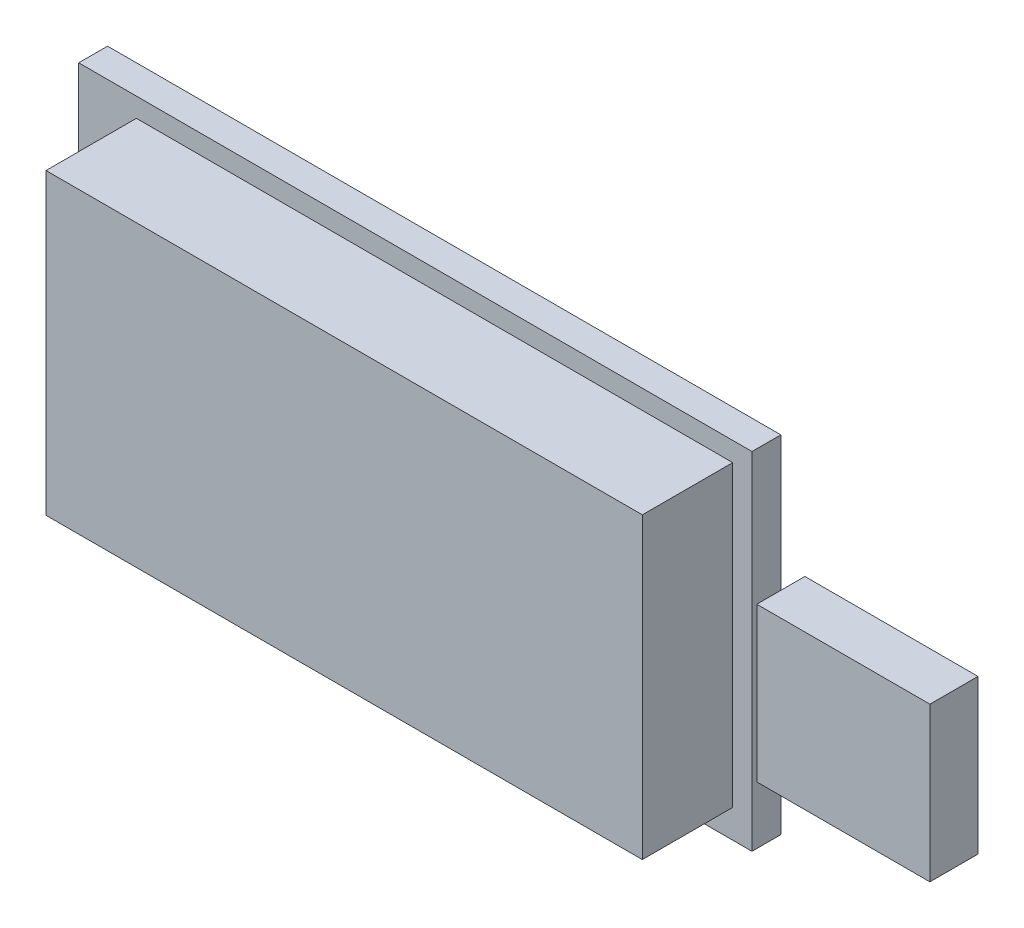
ISO-10303-21;
HEADER;
FILE_DESCRIPTION(('STEP AP214'),'2;1');
FILE_NAME('part.step','',(''),(''),'','','');
FILE_SCHEMA(('AUTOMOTIVE_DESIGN { 1 0 10303 214 1 1 1 1 }'));
ENDSEC;
DATA;
#1=APPLICATION_CONTEXT('core data for automotive mechanical design processes');
#2=APPLICATION_PROTOCOL_DEFINITION('international standard','automotive_design',2000,#1);
#3=PRODUCT_CONTEXT('',#1,'mechanical');
#4=PRODUCT('Part','Part','',(#3));
#5=PRODUCT_RELATED_PRODUCT_CATEGORY('part','',(#4));
#6=PRODUCT_DEFINITION_FORMATION('','',#4);
#7=PRODUCT_DEFINITION_CONTEXT('part definition',#1,'design');
#8=PRODUCT_DEFINITION('design','',#6,#7);
#9=PRODUCT_DEFINITION_SHAPE('','',#8);
#10=(LENGTH_UNIT() NAMED_UNIT(*) SI_UNIT(.MILLI.,.METRE.));
#11=(NAMED_UNIT(*) PLANE_ANGLE_UNIT() SI_UNIT($,.RADIAN.));
#12=(NAMED_UNIT(*) SI_UNIT($,.STERADIAN.) SOLID_ANGLE_UNIT());
#13=UNCERTAINTY_MEASURE_WITH_UNIT(LENGTH_MEASURE(1.E-05),#10,'distance_accuracy_value','');
#14=(GEOMETRIC_REPRESENTATION_CONTEXT(3) GLOBAL_UNCERTAINTY_ASSIGNED_CONTEXT((#13)) GLOBAL_UNIT_ASSIGNED_CONTEXT((#10,
#11,#12)) REPRESENTATION_CONTEXT('',''));
#15=CARTESIAN_POINT('',(0.,0.,0.));
#16=DIRECTION('',(0.,0.,1.));
#17=DIRECTION('',(1.,0.,0.));
#18=AXIS2_PLACEMENT_3D('',#15,#16,#17);
#19=CARTESIAN_POINT('',(35.,0.,1.5));
#20=DIRECTION('',(-1.,0.,0.));
#21=DIRECTION('',(0.,0.,1.));
#22=AXIS2_PLACEMENT_3D('',#19,#20,#21);
#23=PLANE('',#22);
#24=DIRECTION('',(0.,0.,-1.));
#25=VECTOR('',#24,1.);
#26=CARTESIAN_POINT('',(35.,3.,1.25));
#27=LINE('',#26,#25);
#28=CARTESIAN_POINT('',(35.,3.,1.25));
#29=VERTEX_POINT('',#28);
#30=CARTESIAN_POINT('',(35.,3.,0.));
#31=VERTEX_POINT('',#30);
#32=EDGE_CURVE('E167',#29,#31,#27,.T.);
#33=ORIENTED_EDGE('',*,*,#32,.F.);
#34=DIRECTION('',(0.,1.,0.));
#35=VECTOR('',#34,1.);
#36=CARTESIAN_POINT('',(35.,0.,1.25));
#37=LINE('',#36,#35);
#38=CARTESIAN_POINT('',(35.,11.,1.25));
#39=VERTEX_POINT('',#38);
#40=EDGE_CURVE('E244',#29,#39,#37,.T.);
#41=ORIENTED_EDGE('',*,*,#40,.T.);
#42=DIRECTION('',(0.,0.,-1.));
#43=VECTOR('',#42,1.);
#44=CARTESIAN_POINT('',(35.,11.,1.25));
#45=LINE('',#44,#43);
#46=CARTESIAN_POINT('',(35.,11.,0.));
#47=VERTEX_POINT('',#46);
#48=EDGE_CURVE('E241',#39,#47,#45,.T.);
#49=ORIENTED_EDGE('',*,*,#48,.T.);
#50=DIRECTION('',(0.,1.,0.));
#51=VECTOR('',#50,1.);
#52=CARTESIAN_POINT('',(35.,0.,0.));
#53=LINE('',#52,#51);
#54=CARTESIAN_POINT('',(35.,18.,0.));
#55=VERTEX_POINT('',#54);
#56=EDGE_CURVE('E126',#47,#55,#53,.T.);
#57=ORIENTED_EDGE('',*,*,#56,.T.);
#58=DIRECTION('',(0.,0.,-1.));
#59=VECTOR('',#58,1.);
#60=CARTESIAN_POINT('',(35.,18.,1.5));
#61=LINE('',#60,#59);
#62=CARTESIAN_POINT('',(35.,18.,1.5));
#63=VERTEX_POINT('',#62);
#64=EDGE_CURVE('E52',#63,#55,#61,.T.);
#65=ORIENTED_EDGE('',*,*,#64,.F.);
#66=DIRECTION('',(0.,1.,0.));
#67=VECTOR('',#66,1.);
#68=CARTESIAN_POINT('',(35.,0.,1.5));
#69=LINE('',#68,#67);
#70=CARTESIAN_POINT('',(35.,0.,1.5));
#71=VERTEX_POINT('',#70);
#72=EDGE_CURVE('E111',#71,#63,#69,.T.);
#73=ORIENTED_EDGE('',*,*,#72,.F.);
#74=DIRECTION('',(0.,0.,-1.));
#75=VECTOR('',#74,1.);
#76=CARTESIAN_POINT('',(35.,0.,1.5));
#77=LINE('',#76,#75);
#78=CARTESIAN_POINT('',(35.,0.,0.));
#79=VERTEX_POINT('',#78);
#80=EDGE_CURVE('E11',#71,#79,#77,.T.);
#81=ORIENTED_EDGE('',*,*,#80,.T.);
#82=EDGE_CURVE('E144',#79,#31,#53,.T.);
#83=ORIENTED_EDGE('',*,*,#82,.T.);
#84=EDGE_LOOP('',(#33,#41,#49,#57,#65,#73,#81,#83));
#85=FACE_BOUND('',#84,.T.);
#86=ADVANCED_FACE('F43',(#85),#23,.F.);
#87=CARTESIAN_POINT('',(0.,0.,1.5));
#88=DIRECTION('',(0.,1.,0.));
#89=DIRECTION('',(0.,0.,1.));
#90=AXIS2_PLACEMENT_3D('',#87,#88,#89);
#91=PLANE('',#90);
#92=DIRECTION('',(1.,0.,0.));
#93=VECTOR('',#92,1.);
#94=CARTESIAN_POINT('',(0.,0.,0.));
#95=LINE('',#94,#93);
#96=CARTESIAN_POINT('',(0.,0.,0.));
#97=VERTEX_POINT('',#96);
#98=EDGE_CURVE('E140',#97,#79,#95,.T.);
#99=ORIENTED_EDGE('',*,*,#98,.T.);
#100=ORIENTED_EDGE('',*,*,#80,.F.);
#101=DIRECTION('',(1.,0.,0.));
#102=VECTOR('',#101,1.);
#103=CARTESIAN_POINT('',(0.,0.,1.5));
#104=LINE('',#103,#102);
#105=CARTESIAN_POINT('',(0.,0.,1.5));
#106=VERTEX_POINT('',#105);
#107=EDGE_CURVE('E117',#106,#71,#104,.T.);
#108=ORIENTED_EDGE('',*,*,#107,.F.);
#109=DIRECTION('',(0.,0.,-1.));
#110=VECTOR('',#109,1.);
#111=CARTESIAN_POINT('',(0.,0.,1.5));
#112=LINE('',#111,#110);
#113=EDGE_CURVE('E68',#106,#97,#112,.T.);
#114=ORIENTED_EDGE('',*,*,#113,.T.);
#115=EDGE_LOOP('',(#99,#100,#108,#114));
#116=FACE_BOUND('',#115,.T.);
#117=ADVANCED_FACE('F45',(#116),#91,.F.);
#118=CARTESIAN_POINT('',(0.,18.,1.5));
#119=DIRECTION('',(0.,1.,0.));
#120=DIRECTION('',(0.,0.,1.));
#121=AXIS2_PLACEMENT_3D('',#118,#119,#120);
#122=PLANE('',#121);
#123=DIRECTION('',(1.,0.,0.));
#124=VECTOR('',#123,1.);
#125=CARTESIAN_POINT('',(0.,18.,0.));
#126=LINE('',#125,#124);
#127=CARTESIAN_POINT('',(0.,18.,0.));
#128=VERTEX_POINT('',#127);
#129=EDGE_CURVE('E148',#128,#55,#126,.T.);
#130=ORIENTED_EDGE('',*,*,#129,.F.);
#131=DIRECTION('',(0.,0.,-1.));
#132=VECTOR('',#131,1.);
#133=CARTESIAN_POINT('',(0.,18.,1.5));
#134=LINE('',#133,#132);
#135=CARTESIAN_POINT('',(0.,18.,1.5));
#136=VERTEX_POINT('',#135);
#137=EDGE_CURVE('E131',#136,#128,#134,.T.);
#138=ORIENTED_EDGE('',*,*,#137,.F.);
#139=DIRECTION('',(1.,0.,0.));
#140=VECTOR('',#139,1.);
#141=CARTESIAN_POINT('',(0.,18.,1.5));
#142=LINE('',#141,#140);
#143=EDGE_CURVE('E116',#136,#63,#142,.T.);
#144=ORIENTED_EDGE('',*,*,#143,.T.);
#145=ORIENTED_EDGE('',*,*,#64,.T.);
#146=EDGE_LOOP('',(#130,#138,#144,#145));
#147=FACE_BOUND('',#146,.T.);
#148=ADVANCED_FACE('F132',(#147),#122,.T.);
#149=CARTESIAN_POINT('',(0.,0.,1.5));
#150=DIRECTION('',(-1.,0.,0.));
#151=DIRECTION('',(0.,0.,1.));
#152=AXIS2_PLACEMENT_3D('',#149,#150,#151);
#153=PLANE('',#152);
#154=DIRECTION('',(0.,1.,0.));
#155=VECTOR('',#154,1.);
#156=CARTESIAN_POINT('',(0.,0.,0.));
#157=LINE('',#156,#155);
#158=EDGE_CURVE('E152',#97,#128,#157,.T.);
#159=ORIENTED_EDGE('',*,*,#158,.F.);
#160=ORIENTED_EDGE('',*,*,#113,.F.);
#161=DIRECTION('',(0.,1.,0.));
#162=VECTOR('',#161,1.);
#163=CARTESIAN_POINT('',(0.,0.,1.5));
#164=LINE('',#163,#162);
#165=EDGE_CURVE('E134',#106,#136,#164,.T.);
#166=ORIENTED_EDGE('',*,*,#165,.T.);
#167=ORIENTED_EDGE('',*,*,#137,.T.);
#168=EDGE_LOOP('',(#159,#160,#166,#167));
#169=FACE_BOUND('',#168,.T.);
#170=ADVANCED_FACE('F159',(#169),#153,.T.);
#171=CARTESIAN_POINT('',(0.,0.,1.5));
#172=DIRECTION('',(0.,0.,1.));
#173=DIRECTION('',(1.,0.,0.));
#174=AXIS2_PLACEMENT_3D('',#171,#172,#173);
#175=PLANE('',#174);
#176=DIRECTION('',(0.,1.,0.));
#177=VECTOR('',#176,1.);
#178=CARTESIAN_POINT('',(34.,0.,1.5));
#179=LINE('',#178,#177);
#180=CARTESIAN_POINT('',(34.,1.47731756426029,1.5));
#181=VERTEX_POINT('',#180);
#182=CARTESIAN_POINT('',(34.,17.,1.5));
#183=VERTEX_POINT('',#182);
#184=EDGE_CURVE('E96',#181,#183,#179,.T.);
#185=ORIENTED_EDGE('',*,*,#184,.F.);
#186=DIRECTION('',(1.,0.,0.));
#187=VECTOR('',#186,1.);
#188=CARTESIAN_POINT('',(0.,1.47731756426029,1.5));
#189=LINE('',#188,#187);
#190=CARTESIAN_POINT('',(3.,1.47731756426029,1.5));
#191=VERTEX_POINT('',#190);
#192=EDGE_CURVE('E196',#191,#181,#189,.T.);
#193=ORIENTED_EDGE('',*,*,#192,.F.);
#194=DIRECTION('',(0.,-1.,0.));
#195=VECTOR('',#194,1.);
#196=CARTESIAN_POINT('',(3.,0.,1.5));
#197=LINE('',#196,#195);
#198=CARTESIAN_POINT('',(3.,17.,1.5));
#199=VERTEX_POINT('',#198);
#200=EDGE_CURVE('E198',#199,#191,#197,.T.);
#201=ORIENTED_EDGE('',*,*,#200,.F.);
#202=DIRECTION('',(-1.,0.,0.));
#203=VECTOR('',#202,1.);
#204=CARTESIAN_POINT('',(0.,17.,1.5));
#205=LINE('',#204,#203);
#206=EDGE_CURVE('E214',#183,#199,#205,.T.);
#207=ORIENTED_EDGE('',*,*,#206,.F.);
#208=EDGE_LOOP('',(#185,#193,#201,#207));
#209=FACE_BOUND('',#208,.T.);
#210=ORIENTED_EDGE('',*,*,#107,.T.);
#211=ORIENTED_EDGE('',*,*,#72,.T.);
#212=ORIENTED_EDGE('',*,*,#143,.F.);
#213=ORIENTED_EDGE('',*,*,#165,.F.);
#214=EDGE_LOOP('',(#210,#211,#212,#213));
#215=FACE_BOUND('',#214,.T.);
#216=ADVANCED_FACE('F113',(#209,#215),#175,.T.);
#217=CARTESIAN_POINT('',(0.,0.,0.));
#218=DIRECTION('',(0.,0.,1.));
#219=DIRECTION('',(1.,0.,0.));
#220=AXIS2_PLACEMENT_3D('',#217,#218,#219);
#221=PLANE('',#220);
#222=ORIENTED_EDGE('',*,*,#98,.F.);
#223=ORIENTED_EDGE('',*,*,#158,.T.);
#224=ORIENTED_EDGE('',*,*,#129,.T.);
#225=ORIENTED_EDGE('',*,*,#56,.F.);
#226=EDGE_CURVE('E149',#31,#47,#53,.T.);
#227=ORIENTED_EDGE('',*,*,#226,.F.);
#228=ORIENTED_EDGE('',*,*,#82,.F.);
#229=EDGE_LOOP('',(#222,#223,#224,#225,#227,#228));
#230=FACE_BOUND('',#229,.T.);
#231=ADVANCED_FACE('F161',(#230),#221,.F.);
#232=CARTESIAN_POINT('',(0.,1.47731756426029,6.2));
#233=DIRECTION('',(0.,1.,0.));
#234=DIRECTION('',(0.,0.,1.));
#235=AXIS2_PLACEMENT_3D('',#232,#233,#234);
#236=PLANE('',#235);
#237=ORIENTED_EDGE('',*,*,#192,.T.);
#238=DIRECTION('',(0.,0.,-1.));
#239=VECTOR('',#238,1.);
#240=CARTESIAN_POINT('',(34.,1.47731756426029,6.2));
#241=LINE('',#240,#239);
#242=CARTESIAN_POINT('',(34.,1.47731756426029,6.2));
#243=VERTEX_POINT('',#242);
#244=EDGE_CURVE('E143',#243,#181,#241,.T.);
#245=ORIENTED_EDGE('',*,*,#244,.F.);
#246=DIRECTION('',(1.,0.,0.));
#247=VECTOR('',#246,1.);
#248=CARTESIAN_POINT('',(0.,1.47731756426029,6.2));
#249=LINE('',#248,#247);
#250=CARTESIAN_POINT('',(3.,1.47731756426029,6.2));
#251=VERTEX_POINT('',#250);
#252=EDGE_CURVE('E217',#251,#243,#249,.T.);
#253=ORIENTED_EDGE('',*,*,#252,.F.);
#254=DIRECTION('',(0.,0.,-1.));
#255=VECTOR('',#254,1.);
#256=CARTESIAN_POINT('',(3.,1.47731756426029,6.2));
#257=LINE('',#256,#255);
#258=EDGE_CURVE('E209',#251,#191,#257,.T.);
#259=ORIENTED_EDGE('',*,*,#258,.T.);
#260=EDGE_LOOP('',(#237,#245,#253,#259));
#261=FACE_BOUND('',#260,.T.);
#262=ADVANCED_FACE('F216',(#261),#236,.F.);
#263=CARTESIAN_POINT('',(34.,0.,6.2));
#264=DIRECTION('',(-1.,0.,0.));
#265=DIRECTION('',(0.,0.,1.));
#266=AXIS2_PLACEMENT_3D('',#263,#264,#265);
#267=PLANE('',#266);
#268=ORIENTED_EDGE('',*,*,#184,.T.);
#269=DIRECTION('',(0.,0.,-1.));
#270=VECTOR('',#269,1.);
#271=CARTESIAN_POINT('',(34.,17.,6.2));
#272=LINE('',#271,#270);
#273=CARTESIAN_POINT('',(34.,17.,6.2));
#274=VERTEX_POINT('',#273);
#275=EDGE_CURVE('E222',#274,#183,#272,.T.);
#276=ORIENTED_EDGE('',*,*,#275,.F.);
#277=DIRECTION('',(0.,1.,0.));
#278=VECTOR('',#277,1.);
#279=CARTESIAN_POINT('',(34.,0.,6.2));
#280=LINE('',#279,#278);
#281=EDGE_CURVE('E258',#243,#274,#280,.T.);
#282=ORIENTED_EDGE('',*,*,#281,.F.);
#283=ORIENTED_EDGE('',*,*,#244,.T.);
#284=EDGE_LOOP('',(#268,#276,#282,#283));
#285=FACE_BOUND('',#284,.T.);
#286=ADVANCED_FACE('F267',(#285),#267,.F.);
#287=CARTESIAN_POINT('',(0.,17.,6.2));
#288=DIRECTION('',(0.,-1.,0.));
#289=DIRECTION('',(0.,0.,-1.));
#290=AXIS2_PLACEMENT_3D('',#287,#288,#289);
#291=PLANE('',#290);
#292=ORIENTED_EDGE('',*,*,#206,.T.);
#293=DIRECTION('',(0.,0.,-1.));
#294=VECTOR('',#293,1.);
#295=CARTESIAN_POINT('',(3.,17.,6.2));
#296=LINE('',#295,#294);
#297=CARTESIAN_POINT('',(3.,17.,6.2));
#298=VERTEX_POINT('',#297);
#299=EDGE_CURVE('E212',#298,#199,#296,.T.);
#300=ORIENTED_EDGE('',*,*,#299,.F.);
#301=DIRECTION('',(-1.,0.,0.));
#302=VECTOR('',#301,1.);
#303=CARTESIAN_POINT('',(0.,17.,6.2));
#304=LINE('',#303,#302);
#305=EDGE_CURVE('E224',#274,#298,#304,.T.);
#306=ORIENTED_EDGE('',*,*,#305,.F.);
#307=ORIENTED_EDGE('',*,*,#275,.T.);
#308=EDGE_LOOP('',(#292,#300,#306,#307));
#309=FACE_BOUND('',#308,.T.);
#310=ADVANCED_FACE('F265',(#309),#291,.F.);
#311=CARTESIAN_POINT('',(3.,0.,6.2));
#312=DIRECTION('',(1.,0.,0.));
#313=DIRECTION('',(0.,1.,0.));
#314=AXIS2_PLACEMENT_3D('',#311,#312,#313);
#315=PLANE('',#314);
#316=ORIENTED_EDGE('',*,*,#200,.T.);
#317=ORIENTED_EDGE('',*,*,#258,.F.);
#318=DIRECTION('',(0.,-1.,0.));
#319=VECTOR('',#318,1.);
#320=CARTESIAN_POINT('',(3.,0.,6.2));
#321=LINE('',#320,#319);
#322=EDGE_CURVE('E194',#298,#251,#321,.T.);
#323=ORIENTED_EDGE('',*,*,#322,.F.);
#324=ORIENTED_EDGE('',*,*,#299,.T.);
#325=EDGE_LOOP('',(#316,#317,#323,#324));
#326=FACE_BOUND('',#325,.T.);
#327=ADVANCED_FACE('F208',(#326),#315,.F.);
#328=CARTESIAN_POINT('',(0.,0.,6.2));
#329=DIRECTION('',(0.,0.,1.));
#330=DIRECTION('',(1.,0.,0.));
#331=AXIS2_PLACEMENT_3D('',#328,#329,#330);
#332=PLANE('',#331);
#333=ORIENTED_EDGE('',*,*,#252,.T.);
#334=ORIENTED_EDGE('',*,*,#281,.T.);
#335=ORIENTED_EDGE('',*,*,#305,.T.);
#336=ORIENTED_EDGE('',*,*,#322,.T.);
#337=EDGE_LOOP('',(#333,#334,#335,#336));
#338=FACE_BOUND('',#337,.T.);
#339=ADVANCED_FACE('F262',(#338),#332,.T.);
#340=CARTESIAN_POINT('',(44.,0.,1.25));
#341=DIRECTION('',(-1.,0.,0.));
#342=DIRECTION('',(0.,0.,1.));
#343=AXIS2_PLACEMENT_3D('',#340,#341,#342);
#344=PLANE('',#343);
#345=DIRECTION('',(0.,1.,0.));
#346=VECTOR('',#345,1.);
#347=CARTESIAN_POINT('',(44.,0.,-1.25));
#348=LINE('',#347,#346);
#349=CARTESIAN_POINT('',(44.,3.,-1.25));
#350=VERTEX_POINT('',#349);
#351=CARTESIAN_POINT('',(44.,11.,-1.25));
#352=VERTEX_POINT('',#351);
#353=EDGE_CURVE('E431',#350,#352,#348,.T.);
#354=ORIENTED_EDGE('',*,*,#353,.T.);
#355=DIRECTION('',(0.,0.,-1.));
#356=VECTOR('',#355,1.);
#357=CARTESIAN_POINT('',(44.,11.,1.25));
#358=LINE('',#357,#356);
#359=CARTESIAN_POINT('',(44.,11.,1.25));
#360=VERTEX_POINT('',#359);
#361=EDGE_CURVE('E247',#360,#352,#358,.T.);
#362=ORIENTED_EDGE('',*,*,#361,.F.);
#363=DIRECTION('',(0.,1.,0.));
#364=VECTOR('',#363,1.);
#365=CARTESIAN_POINT('',(44.,0.,1.25));
#366=LINE('',#365,#364);
#367=CARTESIAN_POINT('',(44.,3.,1.25));
#368=VERTEX_POINT('',#367);
#369=EDGE_CURVE('E453',#368,#360,#366,.T.);
#370=ORIENTED_EDGE('',*,*,#369,.F.);
#371=DIRECTION('',(0.,0.,-1.));
#372=VECTOR('',#371,1.);
#373=CARTESIAN_POINT('',(44.,3.,1.25));
#374=LINE('',#373,#372);
#375=EDGE_CURVE('E454',#368,#350,#374,.T.);
#376=ORIENTED_EDGE('',*,*,#375,.T.);
#377=EDGE_LOOP('',(#354,#362,#370,#376));
#378=FACE_BOUND('',#377,.T.);
#379=ADVANCED_FACE('F312',(#378),#344,.F.);
#380=CARTESIAN_POINT('',(0.,11.,1.25));
#381=DIRECTION('',(0.,-1.,0.));
#382=DIRECTION('',(0.,0.,-1.));
#383=AXIS2_PLACEMENT_3D('',#380,#381,#382);
#384=PLANE('',#383);
#385=DIRECTION('',(-1.,0.,0.));
#386=VECTOR('',#385,1.);
#387=CARTESIAN_POINT('',(0.,11.,-1.25));
#388=LINE('',#387,#386);
#389=CARTESIAN_POINT('',(35.,11.,-1.25));
#390=VERTEX_POINT('',#389);
#391=EDGE_CURVE('E437',#352,#390,#388,.T.);
#392=ORIENTED_EDGE('',*,*,#391,.T.);
#393=EDGE_CURVE('E59',#47,#390,#45,.T.);
#394=ORIENTED_EDGE('',*,*,#393,.F.);
#395=ORIENTED_EDGE('',*,*,#48,.F.);
#396=DIRECTION('',(-1.,0.,0.));
#397=VECTOR('',#396,1.);
#398=CARTESIAN_POINT('',(0.,11.,1.25));
#399=LINE('',#398,#397);
#400=EDGE_CURVE('E463',#360,#39,#399,.T.);
#401=ORIENTED_EDGE('',*,*,#400,.F.);
#402=ORIENTED_EDGE('',*,*,#361,.T.);
#403=EDGE_LOOP('',(#392,#394,#395,#401,#402));
#404=FACE_BOUND('',#403,.T.);
#405=ADVANCED_FACE('F323',(#404),#384,.F.);
#406=CARTESIAN_POINT('',(35.,0.,1.25));
#407=DIRECTION('',(-1.,0.,0.));
#408=DIRECTION('',(0.,0.,1.));
#409=AXIS2_PLACEMENT_3D('',#406,#407,#408);
#410=PLANE('',#409);
#411=CARTESIAN_POINT('',(35.,3.,-1.25));
#412=VERTEX_POINT('',#411);
#413=EDGE_CURVE('E175',#31,#412,#27,.T.);
#414=ORIENTED_EDGE('',*,*,#413,.F.);
#415=ORIENTED_EDGE('',*,*,#226,.T.);
#416=ORIENTED_EDGE('',*,*,#393,.T.);
#417=DIRECTION('',(0.,1.,0.));
#418=VECTOR('',#417,1.);
#419=CARTESIAN_POINT('',(35.,0.,-1.25));
#420=LINE('',#419,#418);
#421=EDGE_CURVE('E444',#412,#390,#420,.T.);
#422=ORIENTED_EDGE('',*,*,#421,.F.);
#423=EDGE_LOOP('',(#414,#415,#416,#422));
#424=FACE_BOUND('',#423,.T.);
#425=ADVANCED_FACE('F239',(#424),#410,.T.);
#426=CARTESIAN_POINT('',(0.,3.,1.25));
#427=DIRECTION('',(0.,1.,0.));
#428=DIRECTION('',(0.,0.,1.));
#429=AXIS2_PLACEMENT_3D('',#426,#427,#428);
#430=PLANE('',#429);
#431=DIRECTION('',(1.,0.,0.));
#432=VECTOR('',#431,1.);
#433=CARTESIAN_POINT('',(0.,3.,-1.25));
#434=LINE('',#433,#432);
#435=EDGE_CURVE('E435',#412,#350,#434,.T.);
#436=ORIENTED_EDGE('',*,*,#435,.T.);
#437=ORIENTED_EDGE('',*,*,#375,.F.);
#438=DIRECTION('',(1.,0.,0.));
#439=VECTOR('',#438,1.);
#440=CARTESIAN_POINT('',(0.,3.,1.25));
#441=LINE('',#440,#439);
#442=EDGE_CURVE('E447',#29,#368,#441,.T.);
#443=ORIENTED_EDGE('',*,*,#442,.F.);
#444=ORIENTED_EDGE('',*,*,#32,.T.);
#445=ORIENTED_EDGE('',*,*,#413,.T.);
#446=EDGE_LOOP('',(#436,#437,#443,#444,#445));
#447=FACE_BOUND('',#446,.T.);
#448=ADVANCED_FACE('F337',(#447),#430,.F.);
#449=CARTESIAN_POINT('',(0.,0.,1.25));
#450=DIRECTION('',(0.,0.,1.));
#451=DIRECTION('',(1.,0.,0.));
#452=AXIS2_PLACEMENT_3D('',#449,#450,#451);
#453=PLANE('',#452);
#454=ORIENTED_EDGE('',*,*,#369,.T.);
#455=ORIENTED_EDGE('',*,*,#400,.T.);
#456=ORIENTED_EDGE('',*,*,#40,.F.);
#457=ORIENTED_EDGE('',*,*,#442,.T.);
#458=EDGE_LOOP('',(#454,#455,#456,#457));
#459=FACE_BOUND('',#458,.T.);
#460=ADVANCED_FACE('F344',(#459),#453,.T.);
#461=CARTESIAN_POINT('',(0.,0.,-1.25));
#462=DIRECTION('',(0.,0.,1.));
#463=DIRECTION('',(1.,0.,0.));
#464=AXIS2_PLACEMENT_3D('',#461,#462,#463);
#465=PLANE('',#464);
#466=ORIENTED_EDGE('',*,*,#353,.F.);
#467=ORIENTED_EDGE('',*,*,#435,.F.);
#468=ORIENTED_EDGE('',*,*,#421,.T.);
#469=ORIENTED_EDGE('',*,*,#391,.F.);
#470=EDGE_LOOP('',(#466,#467,#468,#469));
#471=FACE_BOUND('',#470,.T.);
#472=ADVANCED_FACE('F352',(#471),#465,.F.);
#473=CLOSED_SHELL('',(#86,#117,#148,#170,#216,#231,#262,#286,#310,#327,#339,#379,#405,#425,#448,
#460,#472));
#474=MANIFOLD_SOLID_BREP('B2',#473);
#475=ADVANCED_BREP_SHAPE_REPRESENTATION('',(#18,#474),#14);
#476=SHAPE_DEFINITION_REPRESENTATION(#9,#475);
ENDSEC;
END-ISO-10303-21;
